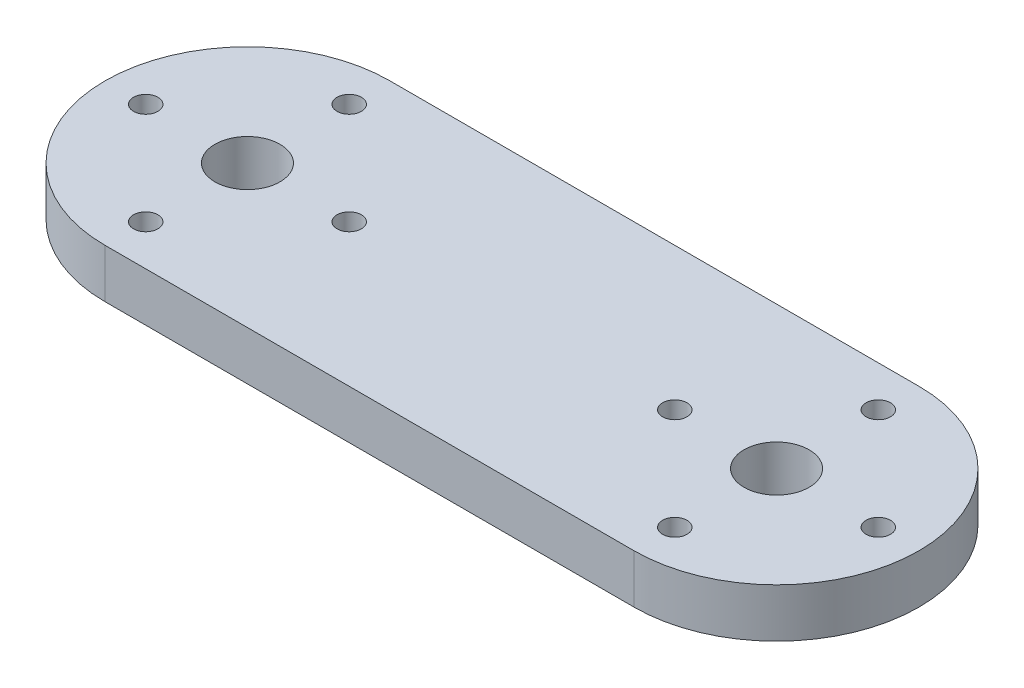
ISO-10303-21;
HEADER;
FILE_DESCRIPTION(('STEP AP214'),'2;1');
FILE_NAME('part.step','',(''),(''),'','','');
FILE_SCHEMA(('AUTOMOTIVE_DESIGN { 1 0 10303 214 1 1 1 1 }'));
ENDSEC;
DATA;
#1=APPLICATION_CONTEXT('core data for automotive mechanical design processes');
#2=APPLICATION_PROTOCOL_DEFINITION('international standard','automotive_design',2000,#1);
#3=PRODUCT_CONTEXT('',#1,'mechanical');
#4=PRODUCT('Part','Part','',(#3));
#5=PRODUCT_RELATED_PRODUCT_CATEGORY('part','',(#4));
#6=PRODUCT_DEFINITION_FORMATION('','',#4);
#7=PRODUCT_DEFINITION_CONTEXT('part definition',#1,'design');
#8=PRODUCT_DEFINITION('design','',#6,#7);
#9=PRODUCT_DEFINITION_SHAPE('','',#8);
#10=(LENGTH_UNIT() NAMED_UNIT(*) SI_UNIT(.MILLI.,.METRE.));
#11=(NAMED_UNIT(*) PLANE_ANGLE_UNIT() SI_UNIT($,.RADIAN.));
#12=(NAMED_UNIT(*) SI_UNIT($,.STERADIAN.) SOLID_ANGLE_UNIT());
#13=UNCERTAINTY_MEASURE_WITH_UNIT(LENGTH_MEASURE(1.E-05),#10,'distance_accuracy_value','');
#14=(GEOMETRIC_REPRESENTATION_CONTEXT(3) GLOBAL_UNCERTAINTY_ASSIGNED_CONTEXT((#13)) GLOBAL_UNIT_ASSIGNED_CONTEXT((#10,
#11,#12)) REPRESENTATION_CONTEXT('',''));
#15=CARTESIAN_POINT('',(0.,0.,0.));
#16=DIRECTION('',(0.,0.,1.));
#17=DIRECTION('',(1.,0.,0.));
#18=AXIS2_PLACEMENT_3D('',#15,#16,#17);
#19=CARTESIAN_POINT('',(0.,6.,0.));
#20=DIRECTION('',(0.,-1.,0.));
#21=DIRECTION('',(0.,0.,-1.));
#22=AXIS2_PLACEMENT_3D('',#19,#20,#21);
#23=CYLINDRICAL_SURFACE('',#22,17.5);
#24=CARTESIAN_POINT('',(0.,0.,0.));
#25=DIRECTION('',(0.,1.,0.));
#26=DIRECTION('',(0.,0.,1.));
#27=AXIS2_PLACEMENT_3D('',#24,#25,#26);
#28=CIRCLE('',#27,17.5);
#29=CARTESIAN_POINT('',(0.,0.,-17.5));
#30=VERTEX_POINT('',#29);
#31=CARTESIAN_POINT('',(0.,0.,17.5));
#32=VERTEX_POINT('',#31);
#33=EDGE_CURVE('E110',#30,#32,#28,.T.);
#34=ORIENTED_EDGE('',*,*,#33,.T.);
#35=DIRECTION('',(0.,-1.,0.));
#36=VECTOR('',#35,1.);
#37=CARTESIAN_POINT('',(0.,6.,17.5));
#38=LINE('',#37,#36);
#39=CARTESIAN_POINT('',(0.,6.,17.5));
#40=VERTEX_POINT('',#39);
#41=EDGE_CURVE('E11',#40,#32,#38,.T.);
#42=ORIENTED_EDGE('',*,*,#41,.F.);
#43=CARTESIAN_POINT('',(0.,6.,0.));
#44=DIRECTION('',(0.,1.,0.));
#45=DIRECTION('',(0.,0.,1.));
#46=AXIS2_PLACEMENT_3D('',#43,#44,#45);
#47=CIRCLE('',#46,17.5);
#48=CARTESIAN_POINT('',(0.,6.,-17.5));
#49=VERTEX_POINT('',#48);
#50=EDGE_CURVE('E89',#49,#40,#47,.T.);
#51=ORIENTED_EDGE('',*,*,#50,.F.);
#52=DIRECTION('',(0.,-1.,0.));
#53=VECTOR('',#52,1.);
#54=CARTESIAN_POINT('',(0.,6.,-17.5));
#55=LINE('',#54,#53);
#56=EDGE_CURVE('E55',#49,#30,#55,.T.);
#57=ORIENTED_EDGE('',*,*,#56,.T.);
#58=EDGE_LOOP('',(#34,#42,#51,#57));
#59=FACE_BOUND('',#58,.T.);
#60=ADVANCED_FACE('F37',(#59),#23,.T.);
#61=CARTESIAN_POINT('',(0.,6.,17.5));
#62=DIRECTION('',(0.,0.,-1.));
#63=DIRECTION('',(-1.,0.,0.));
#64=AXIS2_PLACEMENT_3D('',#61,#62,#63);
#65=PLANE('',#64);
#66=DIRECTION('',(1.,0.,0.));
#67=VECTOR('',#66,1.);
#68=CARTESIAN_POINT('',(0.,0.,17.5));
#69=LINE('',#68,#67);
#70=CARTESIAN_POINT('',(65.,0.,17.5));
#71=VERTEX_POINT('',#70);
#72=EDGE_CURVE('E94',#32,#71,#69,.T.);
#73=ORIENTED_EDGE('',*,*,#72,.T.);
#74=DIRECTION('',(0.,-1.,0.));
#75=VECTOR('',#74,1.);
#76=CARTESIAN_POINT('',(65.,6.,17.5));
#77=LINE('',#76,#75);
#78=CARTESIAN_POINT('',(65.,6.,17.5));
#79=VERTEX_POINT('',#78);
#80=EDGE_CURVE('E46',#79,#71,#77,.T.);
#81=ORIENTED_EDGE('',*,*,#80,.F.);
#82=DIRECTION('',(1.,0.,0.));
#83=VECTOR('',#82,1.);
#84=CARTESIAN_POINT('',(0.,6.,17.5));
#85=LINE('',#84,#83);
#86=EDGE_CURVE('E81',#40,#79,#85,.T.);
#87=ORIENTED_EDGE('',*,*,#86,.F.);
#88=ORIENTED_EDGE('',*,*,#41,.T.);
#89=EDGE_LOOP('',(#73,#81,#87,#88));
#90=FACE_BOUND('',#89,.T.);
#91=ADVANCED_FACE('F93',(#90),#65,.F.);
#92=CARTESIAN_POINT('',(65.,6.,0.));
#93=DIRECTION('',(0.,-1.,0.));
#94=DIRECTION('',(0.,0.,-1.));
#95=AXIS2_PLACEMENT_3D('',#92,#93,#94);
#96=CYLINDRICAL_SURFACE('',#95,17.5);
#97=CARTESIAN_POINT('',(65.,0.,0.));
#98=DIRECTION('',(0.,1.,0.));
#99=DIRECTION('',(0.,0.,1.));
#100=AXIS2_PLACEMENT_3D('',#97,#98,#99);
#101=CIRCLE('',#100,17.5);
#102=CARTESIAN_POINT('',(65.,0.,-17.5));
#103=VERTEX_POINT('',#102);
#104=EDGE_CURVE('E114',#71,#103,#101,.T.);
#105=ORIENTED_EDGE('',*,*,#104,.T.);
#106=DIRECTION('',(0.,-1.,0.));
#107=VECTOR('',#106,1.);
#108=CARTESIAN_POINT('',(65.,6.,-17.5));
#109=LINE('',#108,#107);
#110=CARTESIAN_POINT('',(65.,6.,-17.5));
#111=VERTEX_POINT('',#110);
#112=EDGE_CURVE('E70',#111,#103,#109,.T.);
#113=ORIENTED_EDGE('',*,*,#112,.F.);
#114=CARTESIAN_POINT('',(65.,6.,0.));
#115=DIRECTION('',(0.,1.,0.));
#116=DIRECTION('',(0.,0.,1.));
#117=AXIS2_PLACEMENT_3D('',#114,#115,#116);
#118=CIRCLE('',#117,17.5);
#119=EDGE_CURVE('E88',#79,#111,#118,.T.);
#120=ORIENTED_EDGE('',*,*,#119,.F.);
#121=ORIENTED_EDGE('',*,*,#80,.T.);
#122=EDGE_LOOP('',(#105,#113,#120,#121));
#123=FACE_BOUND('',#122,.T.);
#124=ADVANCED_FACE('F98',(#123),#96,.T.);
#125=CARTESIAN_POINT('',(0.,6.,0.));
#126=DIRECTION('',(0.,-1.,0.));
#127=DIRECTION('',(0.,0.,-1.));
#128=AXIS2_PLACEMENT_3D('',#125,#126,#127);
#129=CYLINDRICAL_SURFACE('',#128,4.);
#130=CARTESIAN_POINT('',(0.,6.,0.));
#131=DIRECTION('',(0.,1.,0.));
#132=DIRECTION('',(0.,0.,1.));
#133=AXIS2_PLACEMENT_3D('',#130,#131,#132);
#134=CIRCLE('',#133,4.);
#135=CARTESIAN_POINT('',(0.,6.,4.));
#136=VERTEX_POINT('',#135);
#137=EDGE_CURVE('E101',#136,#136,#134,.T.);
#138=ORIENTED_EDGE('',*,*,#137,.T.);
#139=EDGE_LOOP('',(#138));
#140=FACE_BOUND('',#139,.T.);
#141=CARTESIAN_POINT('',(0.,0.,0.));
#142=DIRECTION('',(0.,1.,0.));
#143=DIRECTION('',(0.,0.,1.));
#144=AXIS2_PLACEMENT_3D('',#141,#142,#143);
#145=CIRCLE('',#144,4.);
#146=CARTESIAN_POINT('',(0.,0.,4.));
#147=VERTEX_POINT('',#146);
#148=EDGE_CURVE('E119',#147,#147,#145,.T.);
#149=ORIENTED_EDGE('',*,*,#148,.F.);
#150=EDGE_LOOP('',(#149));
#151=FACE_BOUND('',#150,.T.);
#152=ADVANCED_FACE('F224',(#140,#151),#129,.F.);
#153=CARTESIAN_POINT('',(0.,6.,-17.5));
#154=DIRECTION('',(0.,0.,-1.));
#155=DIRECTION('',(-1.,0.,0.));
#156=AXIS2_PLACEMENT_3D('',#153,#154,#155);
#157=PLANE('',#156);
#158=DIRECTION('',(1.,0.,0.));
#159=VECTOR('',#158,1.);
#160=CARTESIAN_POINT('',(0.,0.,-17.5));
#161=LINE('',#160,#159);
#162=EDGE_CURVE('E116',#30,#103,#161,.T.);
#163=ORIENTED_EDGE('',*,*,#162,.F.);
#164=ORIENTED_EDGE('',*,*,#56,.F.);
#165=DIRECTION('',(1.,0.,0.));
#166=VECTOR('',#165,1.);
#167=CARTESIAN_POINT('',(0.,6.,-17.5));
#168=LINE('',#167,#166);
#169=EDGE_CURVE('E99',#49,#111,#168,.T.);
#170=ORIENTED_EDGE('',*,*,#169,.T.);
#171=ORIENTED_EDGE('',*,*,#112,.T.);
#172=EDGE_LOOP('',(#163,#164,#170,#171));
#173=FACE_BOUND('',#172,.T.);
#174=ADVANCED_FACE('F218',(#173),#157,.T.);
#175=CARTESIAN_POINT('',(65.,6.,0.));
#176=DIRECTION('',(0.,-1.,0.));
#177=DIRECTION('',(0.,0.,-1.));
#178=AXIS2_PLACEMENT_3D('',#175,#176,#177);
#179=CYLINDRICAL_SURFACE('',#178,3.99999999999999);
#180=CARTESIAN_POINT('',(65.,6.,0.));
#181=DIRECTION('',(0.,1.,0.));
#182=DIRECTION('',(0.,0.,1.));
#183=AXIS2_PLACEMENT_3D('',#180,#181,#182);
#184=CIRCLE('',#183,3.99999999999999);
#185=CARTESIAN_POINT('',(65.,6.,3.99999999999999));
#186=VERTEX_POINT('',#185);
#187=EDGE_CURVE('E107',#186,#186,#184,.T.);
#188=ORIENTED_EDGE('',*,*,#187,.T.);
#189=EDGE_LOOP('',(#188));
#190=FACE_BOUND('',#189,.T.);
#191=CARTESIAN_POINT('',(65.,0.,0.));
#192=DIRECTION('',(0.,1.,0.));
#193=DIRECTION('',(0.,0.,1.));
#194=AXIS2_PLACEMENT_3D('',#191,#192,#193);
#195=CIRCLE('',#194,3.99999999999999);
#196=CARTESIAN_POINT('',(65.,0.,3.99999999999999));
#197=VERTEX_POINT('',#196);
#198=EDGE_CURVE('E122',#197,#197,#195,.T.);
#199=ORIENTED_EDGE('',*,*,#198,.F.);
#200=EDGE_LOOP('',(#199));
#201=FACE_BOUND('',#200,.T.);
#202=ADVANCED_FACE('F184',(#190,#201),#179,.F.);
#203=CARTESIAN_POINT('',(0.,6.,0.));
#204=DIRECTION('',(0.,1.,0.));
#205=DIRECTION('',(0.,0.,1.));
#206=AXIS2_PLACEMENT_3D('',#203,#204,#205);
#207=PLANE('',#206);
#208=CARTESIAN_POINT('',(77.5,6.,0.));
#209=DIRECTION('',(0.,1.,0.));
#210=DIRECTION('',(0.,0.,1.));
#211=AXIS2_PLACEMENT_3D('',#208,#209,#210);
#212=CIRCLE('',#211,1.5);
#213=CARTESIAN_POINT('',(77.5,6.,1.5));
#214=VERTEX_POINT('',#213);
#215=EDGE_CURVE('E143',#214,#214,#212,.T.);
#216=ORIENTED_EDGE('',*,*,#215,.F.);
#217=EDGE_LOOP('',(#216));
#218=FACE_BOUND('',#217,.T.);
#219=CARTESIAN_POINT('',(65.0000000000001,6.,-12.5000000000001));
#220=DIRECTION('',(0.,1.,0.));
#221=DIRECTION('',(0.,0.,1.));
#222=AXIS2_PLACEMENT_3D('',#219,#220,#221);
#223=CIRCLE('',#222,1.5);
#224=CARTESIAN_POINT('',(65.0000000000001,6.,-11.0000000000001));
#225=VERTEX_POINT('',#224);
#226=EDGE_CURVE('E172',#225,#225,#223,.T.);
#227=ORIENTED_EDGE('',*,*,#226,.F.);
#228=EDGE_LOOP('',(#227));
#229=FACE_BOUND('',#228,.T.);
#230=CARTESIAN_POINT('',(52.5000000000001,6.,-1.11022302462516E-13));
#231=DIRECTION('',(0.,1.,0.));
#232=DIRECTION('',(0.,0.,1.));
#233=AXIS2_PLACEMENT_3D('',#230,#231,#232);
#234=CIRCLE('',#233,1.5);
#235=CARTESIAN_POINT('',(52.5000000000001,6.,1.49999999999989));
#236=VERTEX_POINT('',#235);
#237=EDGE_CURVE('E169',#236,#236,#234,.T.);
#238=ORIENTED_EDGE('',*,*,#237,.F.);
#239=EDGE_LOOP('',(#238));
#240=FACE_BOUND('',#239,.T.);
#241=CARTESIAN_POINT('',(65.,6.,12.5));
#242=DIRECTION('',(0.,1.,0.));
#243=DIRECTION('',(0.,0.,1.));
#244=AXIS2_PLACEMENT_3D('',#241,#242,#243);
#245=CIRCLE('',#244,1.50000000000165);
#246=CARTESIAN_POINT('',(65.,6.,14.0000000000016));
#247=VERTEX_POINT('',#246);
#248=EDGE_CURVE('E166',#247,#247,#245,.T.);
#249=ORIENTED_EDGE('',*,*,#248,.F.);
#250=EDGE_LOOP('',(#249));
#251=FACE_BOUND('',#250,.T.);
#252=CARTESIAN_POINT('',(0.,6.,-12.5));
#253=DIRECTION('',(0.,1.,0.));
#254=DIRECTION('',(0.,0.,1.));
#255=AXIS2_PLACEMENT_3D('',#252,#253,#254);
#256=CIRCLE('',#255,1.5);
#257=CARTESIAN_POINT('',(0.,6.,-11.));
#258=VERTEX_POINT('',#257);
#259=EDGE_CURVE('E131',#258,#258,#256,.T.);
#260=ORIENTED_EDGE('',*,*,#259,.F.);
#261=EDGE_LOOP('',(#260));
#262=FACE_BOUND('',#261,.T.);
#263=CARTESIAN_POINT('',(-12.4999999999996,6.,3.54505963630583E-13));
#264=DIRECTION('',(0.,1.,0.));
#265=DIRECTION('',(0.,0.,1.));
#266=AXIS2_PLACEMENT_3D('',#263,#264,#265);
#267=CIRCLE('',#266,1.50000000000057);
#268=CARTESIAN_POINT('',(-12.4999999999996,6.,1.50000000000092));
#269=VERTEX_POINT('',#268);
#270=EDGE_CURVE('E159',#269,#269,#267,.T.);
#271=ORIENTED_EDGE('',*,*,#270,.F.);
#272=EDGE_LOOP('',(#271));
#273=FACE_BOUND('',#272,.T.);
#274=CARTESIAN_POINT('',(12.5000000000004,6.,-3.52975155131649E-13));
#275=DIRECTION('',(0.,1.,0.));
#276=DIRECTION('',(0.,0.,1.));
#277=AXIS2_PLACEMENT_3D('',#274,#275,#276);
#278=CIRCLE('',#277,1.50000000000028);
#279=CARTESIAN_POINT('',(12.5000000000004,6.,1.49999999999992));
#280=VERTEX_POINT('',#279);
#281=EDGE_CURVE('E154',#280,#280,#278,.T.);
#282=ORIENTED_EDGE('',*,*,#281,.F.);
#283=EDGE_LOOP('',(#282));
#284=FACE_BOUND('',#283,.T.);
#285=CARTESIAN_POINT('',(7.05950310263298E-13,6.,12.5));
#286=DIRECTION('',(0.,1.,0.));
#287=DIRECTION('',(0.,0.,1.));
#288=AXIS2_PLACEMENT_3D('',#285,#286,#287);
#289=CIRCLE('',#288,1.50000000000076);
#290=CARTESIAN_POINT('',(7.05950310263298E-13,6.,14.0000000000008));
#291=VERTEX_POINT('',#290);
#292=EDGE_CURVE('E150',#291,#291,#289,.T.);
#293=ORIENTED_EDGE('',*,*,#292,.F.);
#294=EDGE_LOOP('',(#293));
#295=FACE_BOUND('',#294,.T.);
#296=ORIENTED_EDGE('',*,*,#50,.T.);
#297=ORIENTED_EDGE('',*,*,#86,.T.);
#298=ORIENTED_EDGE('',*,*,#119,.T.);
#299=ORIENTED_EDGE('',*,*,#169,.F.);
#300=EDGE_LOOP('',(#296,#297,#298,#299));
#301=FACE_BOUND('',#300,.T.);
#302=ORIENTED_EDGE('',*,*,#137,.F.);
#303=EDGE_LOOP('',(#302));
#304=FACE_BOUND('',#303,.T.);
#305=ORIENTED_EDGE('',*,*,#187,.F.);
#306=EDGE_LOOP('',(#305));
#307=FACE_BOUND('',#306,.T.);
#308=ADVANCED_FACE('F84',(#218,#229,#240,#251,#262,#273,#284,#295,#301,#304,#307),#207,.T.);
#309=CARTESIAN_POINT('',(0.,0.,0.));
#310=DIRECTION('',(0.,1.,0.));
#311=DIRECTION('',(0.,0.,1.));
#312=AXIS2_PLACEMENT_3D('',#309,#310,#311);
#313=PLANE('',#312);
#314=CARTESIAN_POINT('',(77.5,0.,0.));
#315=DIRECTION('',(0.,1.,0.));
#316=DIRECTION('',(0.,0.,1.));
#317=AXIS2_PLACEMENT_3D('',#314,#315,#316);
#318=CIRCLE('',#317,1.5);
#319=CARTESIAN_POINT('',(77.5,0.,1.5));
#320=VERTEX_POINT('',#319);
#321=EDGE_CURVE('E40',#320,#320,#318,.T.);
#322=ORIENTED_EDGE('',*,*,#321,.T.);
#323=EDGE_LOOP('',(#322));
#324=FACE_BOUND('',#323,.T.);
#325=CARTESIAN_POINT('',(65.0000000000001,0.,-12.5000000000001));
#326=DIRECTION('',(0.,1.,0.));
#327=DIRECTION('',(0.,0.,1.));
#328=AXIS2_PLACEMENT_3D('',#325,#326,#327);
#329=CIRCLE('',#328,1.5);
#330=CARTESIAN_POINT('',(65.0000000000001,0.,-11.0000000000001));
#331=VERTEX_POINT('',#330);
#332=EDGE_CURVE('E145',#331,#331,#329,.T.);
#333=ORIENTED_EDGE('',*,*,#332,.T.);
#334=EDGE_LOOP('',(#333));
#335=FACE_BOUND('',#334,.T.);
#336=CARTESIAN_POINT('',(52.5000000000001,0.,-1.11022302462516E-13));
#337=DIRECTION('',(0.,1.,0.));
#338=DIRECTION('',(0.,0.,1.));
#339=AXIS2_PLACEMENT_3D('',#336,#337,#338);
#340=CIRCLE('',#339,1.5);
#341=CARTESIAN_POINT('',(52.5000000000001,0.,1.49999999999989));
#342=VERTEX_POINT('',#341);
#343=EDGE_CURVE('E142',#342,#342,#340,.T.);
#344=ORIENTED_EDGE('',*,*,#343,.T.);
#345=EDGE_LOOP('',(#344));
#346=FACE_BOUND('',#345,.T.);
#347=CARTESIAN_POINT('',(65.,0.,12.5));
#348=DIRECTION('',(0.,1.,0.));
#349=DIRECTION('',(0.,0.,1.));
#350=AXIS2_PLACEMENT_3D('',#347,#348,#349);
#351=CIRCLE('',#350,1.50000000000165);
#352=CARTESIAN_POINT('',(65.,0.,14.0000000000016));
#353=VERTEX_POINT('',#352);
#354=EDGE_CURVE('E139',#353,#353,#351,.T.);
#355=ORIENTED_EDGE('',*,*,#354,.T.);
#356=EDGE_LOOP('',(#355));
#357=FACE_BOUND('',#356,.T.);
#358=CARTESIAN_POINT('',(0.,0.,-12.5));
#359=DIRECTION('',(0.,1.,0.));
#360=DIRECTION('',(0.,0.,1.));
#361=AXIS2_PLACEMENT_3D('',#358,#359,#360);
#362=CIRCLE('',#361,1.5);
#363=CARTESIAN_POINT('',(0.,0.,-11.));
#364=VERTEX_POINT('',#363);
#365=EDGE_CURVE('E112',#364,#364,#362,.T.);
#366=ORIENTED_EDGE('',*,*,#365,.T.);
#367=EDGE_LOOP('',(#366));
#368=FACE_BOUND('',#367,.T.);
#369=CARTESIAN_POINT('',(-12.4999999999996,0.,3.54505963630583E-13));
#370=DIRECTION('',(0.,1.,0.));
#371=DIRECTION('',(0.,0.,1.));
#372=AXIS2_PLACEMENT_3D('',#369,#370,#371);
#373=CIRCLE('',#372,1.50000000000057);
#374=CARTESIAN_POINT('',(-12.4999999999996,0.,1.50000000000092));
#375=VERTEX_POINT('',#374);
#376=EDGE_CURVE('E134',#375,#375,#373,.T.);
#377=ORIENTED_EDGE('',*,*,#376,.T.);
#378=EDGE_LOOP('',(#377));
#379=FACE_BOUND('',#378,.T.);
#380=CARTESIAN_POINT('',(12.5000000000004,0.,-3.52975155131649E-13));
#381=DIRECTION('',(0.,1.,0.));
#382=DIRECTION('',(0.,0.,1.));
#383=AXIS2_PLACEMENT_3D('',#380,#381,#382);
#384=CIRCLE('',#383,1.50000000000028);
#385=CARTESIAN_POINT('',(12.5000000000004,0.,1.49999999999992));
#386=VERTEX_POINT('',#385);
#387=EDGE_CURVE('E130',#386,#386,#384,.T.);
#388=ORIENTED_EDGE('',*,*,#387,.T.);
#389=EDGE_LOOP('',(#388));
#390=FACE_BOUND('',#389,.T.);
#391=CARTESIAN_POINT('',(7.05950310263298E-13,0.,12.5));
#392=DIRECTION('',(0.,1.,0.));
#393=DIRECTION('',(0.,0.,1.));
#394=AXIS2_PLACEMENT_3D('',#391,#392,#393);
#395=CIRCLE('',#394,1.50000000000076);
#396=CARTESIAN_POINT('',(7.05950310263298E-13,0.,14.0000000000008));
#397=VERTEX_POINT('',#396);
#398=EDGE_CURVE('E127',#397,#397,#395,.T.);
#399=ORIENTED_EDGE('',*,*,#398,.T.);
#400=EDGE_LOOP('',(#399));
#401=FACE_BOUND('',#400,.T.);
#402=ORIENTED_EDGE('',*,*,#33,.F.);
#403=ORIENTED_EDGE('',*,*,#162,.T.);
#404=ORIENTED_EDGE('',*,*,#104,.F.);
#405=ORIENTED_EDGE('',*,*,#72,.F.);
#406=EDGE_LOOP('',(#402,#403,#404,#405));
#407=FACE_BOUND('',#406,.T.);
#408=ORIENTED_EDGE('',*,*,#148,.T.);
#409=EDGE_LOOP('',(#408));
#410=FACE_BOUND('',#409,.T.);
#411=ORIENTED_EDGE('',*,*,#198,.T.);
#412=EDGE_LOOP('',(#411));
#413=FACE_BOUND('',#412,.T.);
#414=ADVANCED_FACE('F183',(#324,#335,#346,#357,#368,#379,#390,#401,#407,#410,#413),#313,.F.);
#415=CARTESIAN_POINT('',(7.05950310263298E-13,-13.,12.5));
#416=DIRECTION('',(0.,1.,0.));
#417=DIRECTION('',(0.,0.,1.));
#418=AXIS2_PLACEMENT_3D('',#415,#416,#417);
#419=CYLINDRICAL_SURFACE('',#418,1.50000000000076);
#420=ORIENTED_EDGE('',*,*,#292,.T.);
#421=EDGE_LOOP('',(#420));
#422=FACE_BOUND('',#421,.T.);
#423=ORIENTED_EDGE('',*,*,#398,.F.);
#424=EDGE_LOOP('',(#423));
#425=FACE_BOUND('',#424,.T.);
#426=ADVANCED_FACE('F203',(#422,#425),#419,.F.);
#427=CARTESIAN_POINT('',(12.5000000000004,-13.,-3.52975155131649E-13));
#428=DIRECTION('',(0.,1.,0.));
#429=DIRECTION('',(0.,0.,1.));
#430=AXIS2_PLACEMENT_3D('',#427,#428,#429);
#431=CYLINDRICAL_SURFACE('',#430,1.50000000000028);
#432=ORIENTED_EDGE('',*,*,#281,.T.);
#433=EDGE_LOOP('',(#432));
#434=FACE_BOUND('',#433,.T.);
#435=ORIENTED_EDGE('',*,*,#387,.F.);
#436=EDGE_LOOP('',(#435));
#437=FACE_BOUND('',#436,.T.);
#438=ADVANCED_FACE('F199',(#434,#437),#431,.F.);
#439=CARTESIAN_POINT('',(-12.4999999999996,-13.,3.54505963630583E-13));
#440=DIRECTION('',(0.,1.,0.));
#441=DIRECTION('',(0.,0.,1.));
#442=AXIS2_PLACEMENT_3D('',#439,#440,#441);
#443=CYLINDRICAL_SURFACE('',#442,1.50000000000057);
#444=ORIENTED_EDGE('',*,*,#270,.T.);
#445=EDGE_LOOP('',(#444));
#446=FACE_BOUND('',#445,.T.);
#447=ORIENTED_EDGE('',*,*,#376,.F.);
#448=EDGE_LOOP('',(#447));
#449=FACE_BOUND('',#448,.T.);
#450=ADVANCED_FACE('F202',(#446,#449),#443,.F.);
#451=CARTESIAN_POINT('',(0.,-13.,-12.5));
#452=DIRECTION('',(0.,1.,0.));
#453=DIRECTION('',(0.,0.,1.));
#454=AXIS2_PLACEMENT_3D('',#451,#452,#453);
#455=CYLINDRICAL_SURFACE('',#454,1.5);
#456=ORIENTED_EDGE('',*,*,#259,.T.);
#457=EDGE_LOOP('',(#456));
#458=FACE_BOUND('',#457,.T.);
#459=ORIENTED_EDGE('',*,*,#365,.F.);
#460=EDGE_LOOP('',(#459));
#461=FACE_BOUND('',#460,.T.);
#462=ADVANCED_FACE('F278',(#458,#461),#455,.F.);
#463=CARTESIAN_POINT('',(65.,-13.,12.5));
#464=DIRECTION('',(0.,1.,0.));
#465=DIRECTION('',(0.,0.,1.));
#466=AXIS2_PLACEMENT_3D('',#463,#464,#465);
#467=CYLINDRICAL_SURFACE('',#466,1.50000000000165);
#468=ORIENTED_EDGE('',*,*,#248,.T.);
#469=EDGE_LOOP('',(#468));
#470=FACE_BOUND('',#469,.T.);
#471=ORIENTED_EDGE('',*,*,#354,.F.);
#472=EDGE_LOOP('',(#471));
#473=FACE_BOUND('',#472,.T.);
#474=ADVANCED_FACE('F288',(#470,#473),#467,.F.);
#475=CARTESIAN_POINT('',(52.5000000000001,-13.,-1.11022302462516E-13));
#476=DIRECTION('',(0.,1.,0.));
#477=DIRECTION('',(0.,0.,1.));
#478=AXIS2_PLACEMENT_3D('',#475,#476,#477);
#479=CYLINDRICAL_SURFACE('',#478,1.5);
#480=ORIENTED_EDGE('',*,*,#237,.T.);
#481=EDGE_LOOP('',(#480));
#482=FACE_BOUND('',#481,.T.);
#483=ORIENTED_EDGE('',*,*,#343,.F.);
#484=EDGE_LOOP('',(#483));
#485=FACE_BOUND('',#484,.T.);
#486=ADVANCED_FACE('F312',(#482,#485),#479,.F.);
#487=CARTESIAN_POINT('',(65.0000000000001,-13.,-12.5000000000001));
#488=DIRECTION('',(0.,1.,0.));
#489=DIRECTION('',(0.,0.,1.));
#490=AXIS2_PLACEMENT_3D('',#487,#488,#489);
#491=CYLINDRICAL_SURFACE('',#490,1.5);
#492=ORIENTED_EDGE('',*,*,#226,.T.);
#493=EDGE_LOOP('',(#492));
#494=FACE_BOUND('',#493,.T.);
#495=ORIENTED_EDGE('',*,*,#332,.F.);
#496=EDGE_LOOP('',(#495));
#497=FACE_BOUND('',#496,.T.);
#498=ADVANCED_FACE('F322',(#494,#497),#491,.F.);
#499=CARTESIAN_POINT('',(77.5,-13.,0.));
#500=DIRECTION('',(0.,1.,0.));
#501=DIRECTION('',(0.,0.,1.));
#502=AXIS2_PLACEMENT_3D('',#499,#500,#501);
#503=CYLINDRICAL_SURFACE('',#502,1.5);
#504=ORIENTED_EDGE('',*,*,#215,.T.);
#505=EDGE_LOOP('',(#504));
#506=FACE_BOUND('',#505,.T.);
#507=ORIENTED_EDGE('',*,*,#321,.F.);
#508=EDGE_LOOP('',(#507));
#509=FACE_BOUND('',#508,.T.);
#510=ADVANCED_FACE('F178',(#506,#509),#503,.F.);
#511=CLOSED_SHELL('',(#60,#91,#124,#152,#174,#202,#308,#414,#426,#438,#450,#462,#474,#486,#498,#510));
#512=MANIFOLD_SOLID_BREP('B2',#511);
#513=ADVANCED_BREP_SHAPE_REPRESENTATION('',(#18,#512),#14);
#514=SHAPE_DEFINITION_REPRESENTATION(#9,#513);
ENDSEC;
END-ISO-10303-21;
